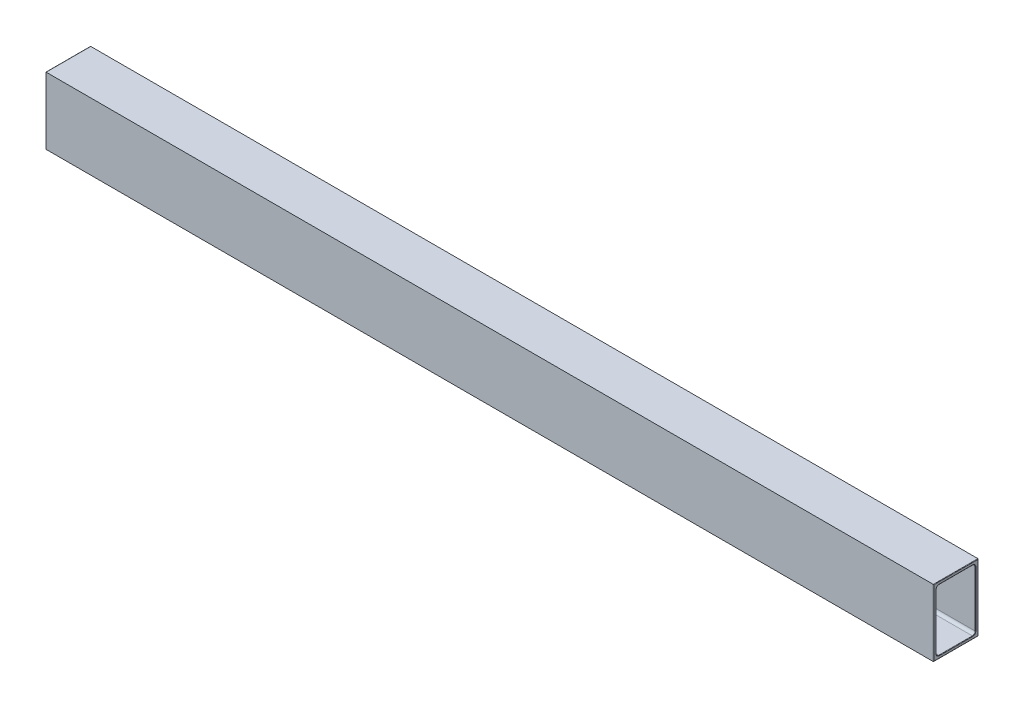
ISO-10303-21;
HEADER;
FILE_DESCRIPTION(('STEP AP214'),'2;1');
FILE_NAME('part.step','',(''),(''),'','','');
FILE_SCHEMA(('AUTOMOTIVE_DESIGN { 1 0 10303 214 1 1 1 1 }'));
ENDSEC;
DATA;
#1=APPLICATION_CONTEXT('core data for automotive mechanical design processes');
#2=APPLICATION_PROTOCOL_DEFINITION('international standard','automotive_design',2000,#1);
#3=PRODUCT_CONTEXT('',#1,'mechanical');
#4=PRODUCT('Part','Part','',(#3));
#5=PRODUCT_RELATED_PRODUCT_CATEGORY('part','',(#4));
#6=PRODUCT_DEFINITION_FORMATION('','',#4);
#7=PRODUCT_DEFINITION_CONTEXT('part definition',#1,'design');
#8=PRODUCT_DEFINITION('design','',#6,#7);
#9=PRODUCT_DEFINITION_SHAPE('','',#8);
#10=(LENGTH_UNIT() NAMED_UNIT(*) SI_UNIT(.MILLI.,.METRE.));
#11=(NAMED_UNIT(*) PLANE_ANGLE_UNIT() SI_UNIT($,.RADIAN.));
#12=(NAMED_UNIT(*) SI_UNIT($,.STERADIAN.) SOLID_ANGLE_UNIT());
#13=UNCERTAINTY_MEASURE_WITH_UNIT(LENGTH_MEASURE(1.E-05),#10,'distance_accuracy_value','');
#14=(GEOMETRIC_REPRESENTATION_CONTEXT(3) GLOBAL_UNCERTAINTY_ASSIGNED_CONTEXT((#13)) GLOBAL_UNIT_ASSIGNED_CONTEXT((#10,
#11,#12)) REPRESENTATION_CONTEXT('',''));
#15=CARTESIAN_POINT('',(0.,0.,0.));
#16=DIRECTION('',(0.,0.,1.));
#17=DIRECTION('',(1.,0.,0.));
#18=AXIS2_PLACEMENT_3D('',#15,#16,#17);
#19=CARTESIAN_POINT('',(2022.623564854,0.,0.));
#20=DIRECTION('',(0.,1.,0.));
#21=DIRECTION('',(0.,0.,1.));
#22=AXIS2_PLACEMENT_3D('',#19,#20,#21);
#23=PLANE('',#22);
#24=DIRECTION('',(0.,0.,-1.));
#25=VECTOR('',#24,1.);
#26=CARTESIAN_POINT('',(858.911782427,0.,0.));
#27=LINE('',#26,#25);
#28=CARTESIAN_POINT('',(858.911782427,0.,101.6));
#29=VERTEX_POINT('',#28);
#30=CARTESIAN_POINT('',(858.911782427,0.,0.));
#31=VERTEX_POINT('',#30);
#32=EDGE_CURVE('E11',#29,#31,#27,.T.);
#33=ORIENTED_EDGE('',*,*,#32,.F.);
#34=DIRECTION('',(-1.,0.,0.));
#35=VECTOR('',#34,1.);
#36=CARTESIAN_POINT('',(2022.623564854,0.,101.6));
#37=LINE('',#36,#35);
#38=CARTESIAN_POINT('',(0.99999999999989,0.,101.6));
#39=VERTEX_POINT('',#38);
#40=EDGE_CURVE('E448',#29,#39,#37,.T.);
#41=ORIENTED_EDGE('',*,*,#40,.T.);
#42=DIRECTION('',(0.,0.,-1.));
#43=VECTOR('',#42,1.);
#44=CARTESIAN_POINT('',(0.99999999999989,0.,0.));
#45=LINE('',#44,#43);
#46=CARTESIAN_POINT('',(0.99999999999989,0.,0.));
#47=VERTEX_POINT('',#46);
#48=EDGE_CURVE('E219',#39,#47,#45,.T.);
#49=ORIENTED_EDGE('',*,*,#48,.T.);
#50=DIRECTION('',(-1.,0.,0.));
#51=VECTOR('',#50,1.);
#52=CARTESIAN_POINT('',(2022.623564854,0.,0.));
#53=LINE('',#52,#51);
#54=EDGE_CURVE('E454',#31,#47,#53,.T.);
#55=ORIENTED_EDGE('',*,*,#54,.F.);
#56=EDGE_LOOP('',(#33,#41,#49,#55));
#57=FACE_BOUND('',#56,.T.);
#58=ADVANCED_FACE('F35',(#57),#23,.F.);
#59=DIRECTION('',(0.,0.,1.));
#60=VECTOR('',#59,1.);
#61=CARTESIAN_POINT('',(1163.711782427,0.,0.));
#62=LINE('',#61,#60);
#63=CARTESIAN_POINT('',(1163.711782427,0.,0.));
#64=VERTEX_POINT('',#63);
#65=CARTESIAN_POINT('',(1163.711782427,0.,101.6));
#66=VERTEX_POINT('',#65);
#67=EDGE_CURVE('E44',#64,#66,#62,.T.);
#68=ORIENTED_EDGE('',*,*,#67,.F.);
#69=CARTESIAN_POINT('',(2021.623564854,0.,0.));
#70=VERTEX_POINT('',#69);
#71=EDGE_CURVE('E450',#70,#64,#53,.T.);
#72=ORIENTED_EDGE('',*,*,#71,.F.);
#73=DIRECTION('',(0.,0.,-1.));
#74=VECTOR('',#73,1.);
#75=CARTESIAN_POINT('',(2021.623564854,0.,101.6));
#76=LINE('',#75,#74);
#77=CARTESIAN_POINT('',(2021.623564854,0.,101.6));
#78=VERTEX_POINT('',#77);
#79=EDGE_CURVE('E303',#70,#78,#76,.F.);
#80=ORIENTED_EDGE('',*,*,#79,.T.);
#81=EDGE_CURVE('E443',#78,#66,#37,.T.);
#82=ORIENTED_EDGE('',*,*,#81,.T.);
#83=EDGE_LOOP('',(#68,#72,#80,#82));
#84=FACE_BOUND('',#83,.T.);
#85=ADVANCED_FACE('F567',(#84),#23,.F.);
#86=CARTESIAN_POINT('',(2022.623564854,0.,0.));
#87=DIRECTION('',(1.,0.,0.));
#88=DIRECTION('',(0.,0.,-1.));
#89=AXIS2_PLACEMENT_3D('',#86,#87,#88);
#90=PLANE('',#89);
#91=DIRECTION('',(0.,1.,0.));
#92=VECTOR('',#91,1.);
#93=CARTESIAN_POINT('',(2022.623564854,0.,5.35));
#94=LINE('',#93,#92);
#95=CARTESIAN_POINT('',(2022.623564854,139.7,5.34999999999999));
#96=VERTEX_POINT('',#95);
#97=CARTESIAN_POINT('',(2022.623564854,12.7,5.35));
#98=VERTEX_POINT('',#97);
#99=EDGE_CURVE('E271',#96,#98,#94,.F.);
#100=ORIENTED_EDGE('',*,*,#99,.T.);
#101=CARTESIAN_POINT('',(2022.623564854,12.7,12.7));
#102=DIRECTION('',(1.,0.,0.));
#103=DIRECTION('',(0.,0.,-1.));
#104=AXIS2_PLACEMENT_3D('',#101,#102,#103);
#105=CIRCLE('',#104,7.35);
#106=CARTESIAN_POINT('',(2022.623564854,5.35,12.7));
#107=VERTEX_POINT('',#106);
#108=EDGE_CURVE('E273',#98,#107,#105,.F.);
#109=ORIENTED_EDGE('',*,*,#108,.T.);
#110=DIRECTION('',(0.,0.,-1.));
#111=VECTOR('',#110,1.);
#112=CARTESIAN_POINT('',(2022.623564854,5.35,0.));
#113=LINE('',#112,#111);
#114=CARTESIAN_POINT('',(2022.623564854,5.34999999999999,88.9));
#115=VERTEX_POINT('',#114);
#116=EDGE_CURVE('E236',#107,#115,#113,.F.);
#117=ORIENTED_EDGE('',*,*,#116,.T.);
#118=CARTESIAN_POINT('',(2022.623564854,12.7,88.9));
#119=DIRECTION('',(1.,0.,0.));
#120=DIRECTION('',(0.,0.,-1.));
#121=AXIS2_PLACEMENT_3D('',#118,#119,#120);
#122=CIRCLE('',#121,7.35);
#123=CARTESIAN_POINT('',(2022.623564854,12.7,96.25));
#124=VERTEX_POINT('',#123);
#125=EDGE_CURVE('E261',#115,#124,#122,.F.);
#126=ORIENTED_EDGE('',*,*,#125,.T.);
#127=DIRECTION('',(0.,-1.,0.));
#128=VECTOR('',#127,1.);
#129=CARTESIAN_POINT('',(2022.623564854,0.,96.25));
#130=LINE('',#129,#128);
#131=CARTESIAN_POINT('',(2022.623564854,139.7,96.25));
#132=VERTEX_POINT('',#131);
#133=EDGE_CURVE('E263',#124,#132,#130,.F.);
#134=ORIENTED_EDGE('',*,*,#133,.T.);
#135=CARTESIAN_POINT('',(2022.623564854,139.7,88.9));
#136=DIRECTION('',(1.,0.,0.));
#137=DIRECTION('',(0.,0.,-1.));
#138=AXIS2_PLACEMENT_3D('',#135,#136,#137);
#139=CIRCLE('',#138,7.34999999999999);
#140=CARTESIAN_POINT('',(2022.623564854,147.05,88.9));
#141=VERTEX_POINT('',#140);
#142=EDGE_CURVE('E265',#132,#141,#139,.F.);
#143=ORIENTED_EDGE('',*,*,#142,.T.);
#144=DIRECTION('',(0.,0.,1.));
#145=VECTOR('',#144,1.);
#146=CARTESIAN_POINT('',(2022.623564854,147.05,1.07124865991555E-13));
#147=LINE('',#146,#145);
#148=CARTESIAN_POINT('',(2022.623564854,147.05,12.7));
#149=VERTEX_POINT('',#148);
#150=EDGE_CURVE('E267',#141,#149,#147,.F.);
#151=ORIENTED_EDGE('',*,*,#150,.T.);
#152=CARTESIAN_POINT('',(2022.623564854,139.7,12.7));
#153=DIRECTION('',(1.,0.,0.));
#154=DIRECTION('',(0.,0.,-1.));
#155=AXIS2_PLACEMENT_3D('',#152,#153,#154);
#156=CIRCLE('',#155,7.35000000000001);
#157=EDGE_CURVE('E269',#149,#96,#156,.F.);
#158=ORIENTED_EDGE('',*,*,#157,.T.);
#159=EDGE_LOOP('',(#100,#109,#117,#126,#134,#143,#151,#158));
#160=FACE_BOUND('',#159,.T.);
#161=DIRECTION('',(0.,-1.,0.));
#162=VECTOR('',#161,1.);
#163=CARTESIAN_POINT('',(2022.623564854,0.,100.6));
#164=LINE('',#163,#162);
#165=CARTESIAN_POINT('',(2022.623564854,151.4,100.6));
#166=VERTEX_POINT('',#165);
#167=CARTESIAN_POINT('',(2022.623564854,0.999999999999982,100.6));
#168=VERTEX_POINT('',#167);
#169=EDGE_CURVE('E255',#166,#168,#164,.T.);
#170=ORIENTED_EDGE('',*,*,#169,.T.);
#171=DIRECTION('',(0.,0.,-1.));
#172=VECTOR('',#171,1.);
#173=CARTESIAN_POINT('',(2022.623564854,1.,0.));
#174=LINE('',#173,#172);
#175=CARTESIAN_POINT('',(2022.623564854,1.,1.));
#176=VERTEX_POINT('',#175);
#177=EDGE_CURVE('E257',#168,#176,#174,.T.);
#178=ORIENTED_EDGE('',*,*,#177,.T.);
#179=DIRECTION('',(0.,1.,0.));
#180=VECTOR('',#179,1.);
#181=CARTESIAN_POINT('',(2022.623564854,152.4,1.));
#182=LINE('',#181,#180);
#183=CARTESIAN_POINT('',(2022.623564854,151.4,1.));
#184=VERTEX_POINT('',#183);
#185=EDGE_CURVE('E246',#176,#184,#182,.T.);
#186=ORIENTED_EDGE('',*,*,#185,.T.);
#187=DIRECTION('',(0.,0.,1.));
#188=VECTOR('',#187,1.);
#189=CARTESIAN_POINT('',(2022.623564854,151.4,101.6));
#190=LINE('',#189,#188);
#191=EDGE_CURVE('E248',#184,#166,#190,.T.);
#192=ORIENTED_EDGE('',*,*,#191,.T.);
#193=EDGE_LOOP('',(#170,#178,#186,#192));
#194=FACE_BOUND('',#193,.T.);
#195=ADVANCED_FACE('F537',(#160,#194),#90,.T.);
#196=CARTESIAN_POINT('',(0.,0.,0.));
#197=DIRECTION('',(1.,0.,0.));
#198=DIRECTION('',(0.,0.,-1.));
#199=AXIS2_PLACEMENT_3D('',#196,#197,#198);
#200=PLANE('',#199);
#201=CARTESIAN_POINT('',(0.,139.7,88.9));
#202=DIRECTION('',(1.,0.,0.));
#203=DIRECTION('',(0.,0.,-1.));
#204=AXIS2_PLACEMENT_3D('',#201,#202,#203);
#205=CIRCLE('',#204,7.34999999999999);
#206=CARTESIAN_POINT('',(0.,147.05,88.9));
#207=VERTEX_POINT('',#206);
#208=CARTESIAN_POINT('',(0.,139.7,96.25));
#209=VERTEX_POINT('',#208);
#210=EDGE_CURVE('E341',#207,#209,#205,.T.);
#211=ORIENTED_EDGE('',*,*,#210,.T.);
#212=DIRECTION('',(0.,-1.,0.));
#213=VECTOR('',#212,1.);
#214=CARTESIAN_POINT('',(0.,12.7,96.25));
#215=LINE('',#214,#213);
#216=CARTESIAN_POINT('',(0.,12.7,96.25));
#217=VERTEX_POINT('',#216);
#218=EDGE_CURVE('E343',#209,#217,#215,.T.);
#219=ORIENTED_EDGE('',*,*,#218,.T.);
#220=CARTESIAN_POINT('',(0.,12.7,88.9));
#221=DIRECTION('',(1.,0.,0.));
#222=DIRECTION('',(0.,0.,-1.));
#223=AXIS2_PLACEMENT_3D('',#220,#221,#222);
#224=CIRCLE('',#223,7.35);
#225=CARTESIAN_POINT('',(0.,5.34999999999999,88.9));
#226=VERTEX_POINT('',#225);
#227=EDGE_CURVE('E329',#217,#226,#224,.T.);
#228=ORIENTED_EDGE('',*,*,#227,.T.);
#229=DIRECTION('',(0.,0.,-1.));
#230=VECTOR('',#229,1.);
#231=CARTESIAN_POINT('',(0.,5.35,12.7));
#232=LINE('',#231,#230);
#233=CARTESIAN_POINT('',(0.,5.35,12.7));
#234=VERTEX_POINT('',#233);
#235=EDGE_CURVE('E331',#226,#234,#232,.T.);
#236=ORIENTED_EDGE('',*,*,#235,.T.);
#237=CARTESIAN_POINT('',(0.,12.7,12.7));
#238=DIRECTION('',(1.,0.,0.));
#239=DIRECTION('',(0.,0.,-1.));
#240=AXIS2_PLACEMENT_3D('',#237,#238,#239);
#241=CIRCLE('',#240,7.35);
#242=CARTESIAN_POINT('',(0.,12.7,5.35));
#243=VERTEX_POINT('',#242);
#244=EDGE_CURVE('E333',#234,#243,#241,.T.);
#245=ORIENTED_EDGE('',*,*,#244,.T.);
#246=DIRECTION('',(0.,1.,0.));
#247=VECTOR('',#246,1.);
#248=CARTESIAN_POINT('',(0.,139.7,5.35));
#249=LINE('',#248,#247);
#250=CARTESIAN_POINT('',(0.,139.7,5.35));
#251=VERTEX_POINT('',#250);
#252=EDGE_CURVE('E335',#243,#251,#249,.T.);
#253=ORIENTED_EDGE('',*,*,#252,.T.);
#254=CARTESIAN_POINT('',(0.,139.7,12.7));
#255=DIRECTION('',(1.,0.,0.));
#256=DIRECTION('',(0.,0.,-1.));
#257=AXIS2_PLACEMENT_3D('',#254,#255,#256);
#258=CIRCLE('',#257,7.35000000000001);
#259=CARTESIAN_POINT('',(0.,147.05,12.7));
#260=VERTEX_POINT('',#259);
#261=EDGE_CURVE('E337',#251,#260,#258,.T.);
#262=ORIENTED_EDGE('',*,*,#261,.T.);
#263=DIRECTION('',(0.,0.,1.));
#264=VECTOR('',#263,1.);
#265=CARTESIAN_POINT('',(0.,147.05,88.9));
#266=LINE('',#265,#264);
#267=EDGE_CURVE('E339',#260,#207,#266,.T.);
#268=ORIENTED_EDGE('',*,*,#267,.T.);
#269=EDGE_LOOP('',(#211,#219,#228,#236,#245,#253,#262,#268));
#270=FACE_BOUND('',#269,.T.);
#271=DIRECTION('',(0.,-1.,0.));
#272=VECTOR('',#271,1.);
#273=CARTESIAN_POINT('',(0.,0.,100.6));
#274=LINE('',#273,#272);
#275=CARTESIAN_POINT('',(0.,0.999999999999982,100.6));
#276=VERTEX_POINT('',#275);
#277=CARTESIAN_POINT('',(0.,151.4,100.6));
#278=VERTEX_POINT('',#277);
#279=EDGE_CURVE('E324',#276,#278,#274,.F.);
#280=ORIENTED_EDGE('',*,*,#279,.T.);
#281=DIRECTION('',(0.,0.,1.));
#282=VECTOR('',#281,1.);
#283=CARTESIAN_POINT('',(0.,151.4,0.));
#284=LINE('',#283,#282);
#285=CARTESIAN_POINT('',(0.,151.4,1.));
#286=VERTEX_POINT('',#285);
#287=EDGE_CURVE('E326',#278,#286,#284,.F.);
#288=ORIENTED_EDGE('',*,*,#287,.T.);
#289=DIRECTION('',(0.,1.,0.));
#290=VECTOR('',#289,1.);
#291=CARTESIAN_POINT('',(0.,0.,1.));
#292=LINE('',#291,#290);
#293=CARTESIAN_POINT('',(0.,1.,1.));
#294=VERTEX_POINT('',#293);
#295=EDGE_CURVE('E320',#286,#294,#292,.F.);
#296=ORIENTED_EDGE('',*,*,#295,.T.);
#297=DIRECTION('',(0.,0.,-1.));
#298=VECTOR('',#297,1.);
#299=CARTESIAN_POINT('',(0.,1.,0.));
#300=LINE('',#299,#298);
#301=EDGE_CURVE('E322',#294,#276,#300,.F.);
#302=ORIENTED_EDGE('',*,*,#301,.T.);
#303=EDGE_LOOP('',(#280,#288,#296,#302));
#304=FACE_BOUND('',#303,.T.);
#305=ADVANCED_FACE('F422',(#270,#304),#200,.F.);
#306=CARTESIAN_POINT('',(2022.623564854,0.,0.));
#307=DIRECTION('',(0.,0.,1.));
#308=DIRECTION('',(1.,0.,0.));
#309=AXIS2_PLACEMENT_3D('',#306,#307,#308);
#310=PLANE('',#309);
#311=DIRECTION('',(-1.,0.,0.));
#312=VECTOR('',#311,1.);
#313=CARTESIAN_POINT('',(2022.623564854,152.4,0.));
#314=LINE('',#313,#312);
#315=CARTESIAN_POINT('',(2021.623564854,152.4,0.));
#316=VERTEX_POINT('',#315);
#317=CARTESIAN_POINT('',(0.99999999999989,152.4,0.));
#318=VERTEX_POINT('',#317);
#319=EDGE_CURVE('E250',#316,#318,#314,.T.);
#320=ORIENTED_EDGE('',*,*,#319,.F.);
#321=DIRECTION('',(0.,1.,0.));
#322=VECTOR('',#321,1.);
#323=CARTESIAN_POINT('',(2021.623564854,0.,0.));
#324=LINE('',#323,#322);
#325=EDGE_CURVE('E318',#316,#70,#324,.F.);
#326=ORIENTED_EDGE('',*,*,#325,.T.);
#327=ORIENTED_EDGE('',*,*,#71,.T.);
#328=EDGE_CURVE('E453',#64,#31,#53,.T.);
#329=ORIENTED_EDGE('',*,*,#328,.T.);
#330=ORIENTED_EDGE('',*,*,#54,.T.);
#331=DIRECTION('',(0.,1.,0.));
#332=VECTOR('',#331,1.);
#333=CARTESIAN_POINT('',(0.99999999999989,0.,0.));
#334=LINE('',#333,#332);
#335=EDGE_CURVE('E316',#47,#318,#334,.T.);
#336=ORIENTED_EDGE('',*,*,#335,.T.);
#337=EDGE_LOOP('',(#320,#326,#327,#329,#330,#336));
#338=FACE_BOUND('',#337,.T.);
#339=ADVANCED_FACE('F584',(#338),#310,.F.);
#340=CARTESIAN_POINT('',(2022.623564854,152.4,0.));
#341=DIRECTION('',(0.,-1.,0.));
#342=DIRECTION('',(0.,0.,-1.));
#343=AXIS2_PLACEMENT_3D('',#340,#341,#342);
#344=PLANE('',#343);
#345=DIRECTION('',(-1.,0.,0.));
#346=VECTOR('',#345,1.);
#347=CARTESIAN_POINT('',(2022.623564854,152.4,101.6));
#348=LINE('',#347,#346);
#349=CARTESIAN_POINT('',(2021.623564854,152.4,101.6));
#350=VERTEX_POINT('',#349);
#351=CARTESIAN_POINT('',(0.99999999999989,152.4,101.6));
#352=VERTEX_POINT('',#351);
#353=EDGE_CURVE('E437',#350,#352,#348,.T.);
#354=ORIENTED_EDGE('',*,*,#353,.F.);
#355=DIRECTION('',(0.,0.,1.));
#356=VECTOR('',#355,1.);
#357=CARTESIAN_POINT('',(2021.623564854,152.4,0.));
#358=LINE('',#357,#356);
#359=EDGE_CURVE('E314',#350,#316,#358,.F.);
#360=ORIENTED_EDGE('',*,*,#359,.T.);
#361=ORIENTED_EDGE('',*,*,#319,.T.);
#362=DIRECTION('',(0.,0.,1.));
#363=VECTOR('',#362,1.);
#364=CARTESIAN_POINT('',(0.99999999999989,152.4,0.));
#365=LINE('',#364,#363);
#366=EDGE_CURVE('E311',#318,#352,#365,.T.);
#367=ORIENTED_EDGE('',*,*,#366,.T.);
#368=EDGE_LOOP('',(#354,#360,#361,#367));
#369=FACE_BOUND('',#368,.T.);
#370=ADVANCED_FACE('F436',(#369),#344,.F.);
#371=CARTESIAN_POINT('',(2022.623564854,0.,101.6));
#372=DIRECTION('',(0.,0.,-1.));
#373=DIRECTION('',(-1.,0.,0.));
#374=AXIS2_PLACEMENT_3D('',#371,#372,#373);
#375=PLANE('',#374);
#376=ORIENTED_EDGE('',*,*,#81,.F.);
#377=DIRECTION('',(0.,-1.,0.));
#378=VECTOR('',#377,1.);
#379=CARTESIAN_POINT('',(2021.623564854,152.4,101.6));
#380=LINE('',#379,#378);
#381=EDGE_CURVE('E309',#78,#350,#380,.F.);
#382=ORIENTED_EDGE('',*,*,#381,.T.);
#383=ORIENTED_EDGE('',*,*,#353,.T.);
#384=DIRECTION('',(0.,-1.,0.));
#385=VECTOR('',#384,1.);
#386=CARTESIAN_POINT('',(0.99999999999989,0.,101.6));
#387=LINE('',#386,#385);
#388=EDGE_CURVE('E306',#352,#39,#387,.T.);
#389=ORIENTED_EDGE('',*,*,#388,.T.);
#390=ORIENTED_EDGE('',*,*,#40,.F.);
#391=EDGE_CURVE('E446',#66,#29,#37,.T.);
#392=ORIENTED_EDGE('',*,*,#391,.F.);
#393=EDGE_LOOP('',(#376,#382,#383,#389,#390,#392));
#394=FACE_BOUND('',#393,.T.);
#395=ADVANCED_FACE('F441',(#394),#375,.F.);
#396=ORIENTED_EDGE('',*,*,#391,.T.);
#397=ORIENTED_EDGE('',*,*,#32,.T.);
#398=ORIENTED_EDGE('',*,*,#328,.F.);
#399=ORIENTED_EDGE('',*,*,#67,.T.);
#400=EDGE_LOOP('',(#396,#397,#398,#399));
#401=FACE_BOUND('',#400,.T.);
#402=ADVANCED_FACE('F569',(#401),#23,.F.);
#403=CARTESIAN_POINT('',(2022.623564854,12.7,88.9));
#404=DIRECTION('',(-1.,0.,0.));
#405=DIRECTION('',(0.,0.,1.));
#406=AXIS2_PLACEMENT_3D('',#403,#404,#405);
#407=CYLINDRICAL_SURFACE('',#406,6.35);
#408=DIRECTION('',(-1.,0.,0.));
#409=VECTOR('',#408,1.);
#410=CARTESIAN_POINT('',(2022.623564854,12.7,95.25));
#411=LINE('',#410,#409);
#412=CARTESIAN_POINT('',(2021.623564854,12.7,95.25));
#413=VERTEX_POINT('',#412);
#414=CARTESIAN_POINT('',(0.99999999999989,12.7,95.25));
#415=VERTEX_POINT('',#414);
#416=EDGE_CURVE('E364',#413,#415,#411,.T.);
#417=ORIENTED_EDGE('',*,*,#416,.F.);
#418=CARTESIAN_POINT('',(2021.623564854,12.7,88.9));
#419=DIRECTION('',(1.,0.,0.));
#420=DIRECTION('',(0.,0.,-1.));
#421=AXIS2_PLACEMENT_3D('',#418,#419,#420);
#422=CIRCLE('',#421,6.35);
#423=CARTESIAN_POINT('',(2021.623564854,6.34999999999999,88.9));
#424=VERTEX_POINT('',#423);
#425=EDGE_CURVE('E298',#413,#424,#422,.T.);
#426=ORIENTED_EDGE('',*,*,#425,.T.);
#427=DIRECTION('',(-1.,0.,0.));
#428=VECTOR('',#427,1.);
#429=CARTESIAN_POINT('',(2022.623564854,6.34999999999999,88.9));
#430=LINE('',#429,#428);
#431=CARTESIAN_POINT('',(0.99999999999989,6.34999999999999,88.9));
#432=VERTEX_POINT('',#431);
#433=EDGE_CURVE('E214',#424,#432,#430,.T.);
#434=ORIENTED_EDGE('',*,*,#433,.T.);
#435=CARTESIAN_POINT('',(0.99999999999989,12.7,88.9));
#436=DIRECTION('',(1.,0.,0.));
#437=DIRECTION('',(0.,0.,-1.));
#438=AXIS2_PLACEMENT_3D('',#435,#436,#437);
#439=CIRCLE('',#438,6.35);
#440=EDGE_CURVE('E296',#432,#415,#439,.F.);
#441=ORIENTED_EDGE('',*,*,#440,.T.);
#442=EDGE_LOOP('',(#417,#426,#434,#441));
#443=FACE_BOUND('',#442,.T.);
#444=ADVANCED_FACE('F530',(#443),#407,.F.);
#445=CARTESIAN_POINT('',(2022.623564854,6.35,12.7));
#446=DIRECTION('',(0.,1.,0.));
#447=DIRECTION('',(0.,0.,1.));
#448=AXIS2_PLACEMENT_3D('',#445,#446,#447);
#449=PLANE('',#448);
#450=ORIENTED_EDGE('',*,*,#433,.F.);
#451=DIRECTION('',(0.,0.,-1.));
#452=VECTOR('',#451,1.);
#453=CARTESIAN_POINT('',(2021.623564854,6.35,12.7));
#454=LINE('',#453,#452);
#455=CARTESIAN_POINT('',(2021.623564854,6.35,12.7));
#456=VERTEX_POINT('',#455);
#457=EDGE_CURVE('E208',#424,#456,#454,.T.);
#458=ORIENTED_EDGE('',*,*,#457,.T.);
#459=DIRECTION('',(-1.,0.,0.));
#460=VECTOR('',#459,1.);
#461=CARTESIAN_POINT('',(2022.623564854,6.35,12.7));
#462=LINE('',#461,#460);
#463=CARTESIAN_POINT('',(0.99999999999989,6.35,12.7));
#464=VERTEX_POINT('',#463);
#465=EDGE_CURVE('E211',#456,#464,#462,.T.);
#466=ORIENTED_EDGE('',*,*,#465,.T.);
#467=DIRECTION('',(0.,0.,-1.));
#468=VECTOR('',#467,1.);
#469=CARTESIAN_POINT('',(1.,6.34999999999999,88.9));
#470=LINE('',#469,#468);
#471=EDGE_CURVE('E220',#464,#432,#470,.F.);
#472=ORIENTED_EDGE('',*,*,#471,.T.);
#473=EDGE_LOOP('',(#450,#458,#466,#472));
#474=FACE_BOUND('',#473,.T.);
#475=ADVANCED_FACE('F210',(#474),#449,.T.);
#476=CARTESIAN_POINT('',(2022.623564854,12.7,12.7));
#477=DIRECTION('',(-1.,0.,0.));
#478=DIRECTION('',(0.,0.,1.));
#479=AXIS2_PLACEMENT_3D('',#476,#477,#478);
#480=CYLINDRICAL_SURFACE('',#479,6.35);
#481=ORIENTED_EDGE('',*,*,#465,.F.);
#482=CARTESIAN_POINT('',(2021.623564854,12.7,12.7));
#483=DIRECTION('',(1.,0.,0.));
#484=DIRECTION('',(0.,0.,-1.));
#485=AXIS2_PLACEMENT_3D('',#482,#483,#484);
#486=CIRCLE('',#485,6.35);
#487=CARTESIAN_POINT('',(2021.623564854,12.7,6.35));
#488=VERTEX_POINT('',#487);
#489=EDGE_CURVE('E227',#456,#488,#486,.T.);
#490=ORIENTED_EDGE('',*,*,#489,.T.);
#491=DIRECTION('',(-1.,0.,0.));
#492=VECTOR('',#491,1.);
#493=CARTESIAN_POINT('',(2022.623564854,12.7,6.35));
#494=LINE('',#493,#492);
#495=CARTESIAN_POINT('',(0.99999999999989,12.7,6.35));
#496=VERTEX_POINT('',#495);
#497=EDGE_CURVE('E231',#488,#496,#494,.T.);
#498=ORIENTED_EDGE('',*,*,#497,.T.);
#499=CARTESIAN_POINT('',(0.99999999999989,12.7,12.7));
#500=DIRECTION('',(1.,0.,0.));
#501=DIRECTION('',(0.,0.,-1.));
#502=AXIS2_PLACEMENT_3D('',#499,#500,#501);
#503=CIRCLE('',#502,6.35);
#504=EDGE_CURVE('E230',#496,#464,#503,.F.);
#505=ORIENTED_EDGE('',*,*,#504,.T.);
#506=EDGE_LOOP('',(#481,#490,#498,#505));
#507=FACE_BOUND('',#506,.T.);
#508=ADVANCED_FACE('F224',(#507),#480,.F.);
#509=CARTESIAN_POINT('',(2022.623564854,12.7,6.35));
#510=DIRECTION('',(0.,0.,1.));
#511=DIRECTION('',(0.,-1.,0.));
#512=AXIS2_PLACEMENT_3D('',#509,#510,#511);
#513=PLANE('',#512);
#514=ORIENTED_EDGE('',*,*,#497,.F.);
#515=DIRECTION('',(0.,1.,0.));
#516=VECTOR('',#515,1.);
#517=CARTESIAN_POINT('',(2021.623564854,12.7,6.35));
#518=LINE('',#517,#516);
#519=CARTESIAN_POINT('',(2021.623564854,139.7,6.34999999999999));
#520=VERTEX_POINT('',#519);
#521=EDGE_CURVE('E277',#488,#520,#518,.T.);
#522=ORIENTED_EDGE('',*,*,#521,.T.);
#523=DIRECTION('',(-1.,0.,0.));
#524=VECTOR('',#523,1.);
#525=CARTESIAN_POINT('',(2022.623564854,139.7,6.34999999999999));
#526=LINE('',#525,#524);
#527=CARTESIAN_POINT('',(0.99999999999989,139.7,6.34999999999999));
#528=VERTEX_POINT('',#527);
#529=EDGE_CURVE('E457',#520,#528,#526,.T.);
#530=ORIENTED_EDGE('',*,*,#529,.T.);
#531=DIRECTION('',(0.,1.,0.));
#532=VECTOR('',#531,1.);
#533=CARTESIAN_POINT('',(1.,12.7,6.35));
#534=LINE('',#533,#532);
#535=EDGE_CURVE('E275',#528,#496,#534,.F.);
#536=ORIENTED_EDGE('',*,*,#535,.T.);
#537=EDGE_LOOP('',(#514,#522,#530,#536));
#538=FACE_BOUND('',#537,.T.);
#539=ADVANCED_FACE('F519',(#538),#513,.T.);
#540=CARTESIAN_POINT('',(2022.623564854,139.7,12.7));
#541=DIRECTION('',(-1.,0.,0.));
#542=DIRECTION('',(0.,0.,1.));
#543=AXIS2_PLACEMENT_3D('',#540,#541,#542);
#544=CYLINDRICAL_SURFACE('',#543,6.35000000000001);
#545=ORIENTED_EDGE('',*,*,#529,.F.);
#546=CARTESIAN_POINT('',(2021.623564854,139.7,12.7));
#547=DIRECTION('',(1.,0.,0.));
#548=DIRECTION('',(0.,0.,-1.));
#549=AXIS2_PLACEMENT_3D('',#546,#547,#548);
#550=CIRCLE('',#549,6.35000000000001);
#551=CARTESIAN_POINT('',(2021.623564854,146.05,12.7));
#552=VERTEX_POINT('',#551);
#553=EDGE_CURVE('E281',#520,#552,#550,.T.);
#554=ORIENTED_EDGE('',*,*,#553,.T.);
#555=DIRECTION('',(-1.,0.,0.));
#556=VECTOR('',#555,1.);
#557=CARTESIAN_POINT('',(2022.623564854,146.05,12.7));
#558=LINE('',#557,#556);
#559=CARTESIAN_POINT('',(0.99999999999989,146.05,12.7));
#560=VERTEX_POINT('',#559);
#561=EDGE_CURVE('E460',#552,#560,#558,.T.);
#562=ORIENTED_EDGE('',*,*,#561,.T.);
#563=CARTESIAN_POINT('',(0.99999999999989,139.7,12.7));
#564=DIRECTION('',(1.,0.,0.));
#565=DIRECTION('',(0.,0.,-1.));
#566=AXIS2_PLACEMENT_3D('',#563,#564,#565);
#567=CIRCLE('',#566,6.35000000000001);
#568=EDGE_CURVE('E279',#560,#528,#567,.F.);
#569=ORIENTED_EDGE('',*,*,#568,.T.);
#570=EDGE_LOOP('',(#545,#554,#562,#569));
#571=FACE_BOUND('',#570,.T.);
#572=ADVANCED_FACE('F515',(#571),#544,.F.);
#573=CARTESIAN_POINT('',(2022.623564854,146.05,12.7));
#574=DIRECTION('',(0.,-1.,0.));
#575=DIRECTION('',(0.,0.,-1.));
#576=AXIS2_PLACEMENT_3D('',#573,#574,#575);
#577=PLANE('',#576);
#578=ORIENTED_EDGE('',*,*,#561,.F.);
#579=DIRECTION('',(0.,0.,1.));
#580=VECTOR('',#579,1.);
#581=CARTESIAN_POINT('',(2021.623564854,146.05,12.7));
#582=LINE('',#581,#580);
#583=CARTESIAN_POINT('',(2021.623564854,146.05,88.9));
#584=VERTEX_POINT('',#583);
#585=EDGE_CURVE('E285',#552,#584,#582,.T.);
#586=ORIENTED_EDGE('',*,*,#585,.T.);
#587=DIRECTION('',(-1.,0.,0.));
#588=VECTOR('',#587,1.);
#589=CARTESIAN_POINT('',(2022.623564854,146.05,88.9));
#590=LINE('',#589,#588);
#591=CARTESIAN_POINT('',(0.99999999999989,146.05,88.9));
#592=VERTEX_POINT('',#591);
#593=EDGE_CURVE('E463',#584,#592,#590,.T.);
#594=ORIENTED_EDGE('',*,*,#593,.T.);
#595=DIRECTION('',(0.,0.,1.));
#596=VECTOR('',#595,1.);
#597=CARTESIAN_POINT('',(1.,146.05,12.7));
#598=LINE('',#597,#596);
#599=EDGE_CURVE('E283',#592,#560,#598,.F.);
#600=ORIENTED_EDGE('',*,*,#599,.T.);
#601=EDGE_LOOP('',(#578,#586,#594,#600));
#602=FACE_BOUND('',#601,.T.);
#603=ADVANCED_FACE('F503',(#602),#577,.T.);
#604=CARTESIAN_POINT('',(2022.623564854,139.7,88.9));
#605=DIRECTION('',(-1.,0.,0.));
#606=DIRECTION('',(0.,0.,1.));
#607=AXIS2_PLACEMENT_3D('',#604,#605,#606);
#608=CYLINDRICAL_SURFACE('',#607,6.34999999999999);
#609=ORIENTED_EDGE('',*,*,#593,.F.);
#610=CARTESIAN_POINT('',(2021.623564854,139.7,88.9));
#611=DIRECTION('',(1.,0.,0.));
#612=DIRECTION('',(0.,0.,-1.));
#613=AXIS2_PLACEMENT_3D('',#610,#611,#612);
#614=CIRCLE('',#613,6.34999999999999);
#615=CARTESIAN_POINT('',(2021.623564854,139.7,95.25));
#616=VERTEX_POINT('',#615);
#617=EDGE_CURVE('E289',#584,#616,#614,.T.);
#618=ORIENTED_EDGE('',*,*,#617,.T.);
#619=DIRECTION('',(-1.,0.,0.));
#620=VECTOR('',#619,1.);
#621=CARTESIAN_POINT('',(2022.623564854,139.7,95.25));
#622=LINE('',#621,#620);
#623=CARTESIAN_POINT('',(0.99999999999989,139.7,95.25));
#624=VERTEX_POINT('',#623);
#625=EDGE_CURVE('E466',#616,#624,#622,.T.);
#626=ORIENTED_EDGE('',*,*,#625,.T.);
#627=CARTESIAN_POINT('',(0.99999999999989,139.7,88.9));
#628=DIRECTION('',(1.,0.,0.));
#629=DIRECTION('',(0.,0.,-1.));
#630=AXIS2_PLACEMENT_3D('',#627,#628,#629);
#631=CIRCLE('',#630,6.34999999999999);
#632=EDGE_CURVE('E287',#624,#592,#631,.F.);
#633=ORIENTED_EDGE('',*,*,#632,.T.);
#634=EDGE_LOOP('',(#609,#618,#626,#633));
#635=FACE_BOUND('',#634,.T.);
#636=ADVANCED_FACE('F498',(#635),#608,.F.);
#637=CARTESIAN_POINT('',(2022.623564854,12.7,95.25));
#638=DIRECTION('',(0.,0.,-1.));
#639=DIRECTION('',(-1.,0.,0.));
#640=AXIS2_PLACEMENT_3D('',#637,#638,#639);
#641=PLANE('',#640);
#642=ORIENTED_EDGE('',*,*,#625,.F.);
#643=DIRECTION('',(0.,-1.,0.));
#644=VECTOR('',#643,1.);
#645=CARTESIAN_POINT('',(2021.623564854,12.7,95.25));
#646=LINE('',#645,#644);
#647=EDGE_CURVE('E294',#616,#413,#646,.T.);
#648=ORIENTED_EDGE('',*,*,#647,.T.);
#649=ORIENTED_EDGE('',*,*,#416,.T.);
#650=DIRECTION('',(0.,-1.,0.));
#651=VECTOR('',#650,1.);
#652=CARTESIAN_POINT('',(1.,139.7,95.25));
#653=LINE('',#652,#651);
#654=EDGE_CURVE('E291',#415,#624,#653,.F.);
#655=ORIENTED_EDGE('',*,*,#654,.T.);
#656=EDGE_LOOP('',(#642,#648,#649,#655));
#657=FACE_BOUND('',#656,.T.);
#658=ADVANCED_FACE('F474',(#657),#641,.T.);
#659=CARTESIAN_POINT('',(2021.623564854,139.7,88.9));
#660=DIRECTION('',(1.,0.,0.));
#661=DIRECTION('',(0.,0.,-1.));
#662=AXIS2_PLACEMENT_3D('',#659,#660,#661);
#663=TOROIDAL_SURFACE('',#662,7.34999999999999,1.);
#664=CARTESIAN_POINT('',(2021.623564854,147.05,88.9));
#665=DIRECTION('',(0.,0.,-1.));
#666=DIRECTION('',(-1.,0.,0.));
#667=AXIS2_PLACEMENT_3D('',#664,#665,#666);
#668=CIRCLE('',#667,1.);
#669=EDGE_CURVE('E358',#141,#584,#668,.T.);
#670=ORIENTED_EDGE('',*,*,#669,.F.);
#671=ORIENTED_EDGE('',*,*,#142,.F.);
#672=CARTESIAN_POINT('',(2021.623564854,139.7,96.25));
#673=DIRECTION('',(0.,-1.,0.));
#674=DIRECTION('',(0.,0.,-1.));
#675=AXIS2_PLACEMENT_3D('',#672,#673,#674);
#676=CIRCLE('',#675,1.);
#677=EDGE_CURVE('E361',#616,#132,#676,.T.);
#678=ORIENTED_EDGE('',*,*,#677,.F.);
#679=ORIENTED_EDGE('',*,*,#617,.F.);
#680=EDGE_LOOP('',(#670,#671,#678,#679));
#681=FACE_BOUND('',#680,.T.);
#682=ADVANCED_FACE('F545',(#681),#663,.T.);
#683=CARTESIAN_POINT('',(2021.623564854,12.7,96.25));
#684=DIRECTION('',(0.,-1.,0.));
#685=DIRECTION('',(0.,0.,-1.));
#686=AXIS2_PLACEMENT_3D('',#683,#684,#685);
#687=CYLINDRICAL_SURFACE('',#686,1.);
#688=ORIENTED_EDGE('',*,*,#677,.T.);
#689=ORIENTED_EDGE('',*,*,#133,.F.);
#690=CARTESIAN_POINT('',(2021.623564854,12.7,96.25));
#691=DIRECTION('',(0.,-1.,0.));
#692=DIRECTION('',(0.,0.,-1.));
#693=AXIS2_PLACEMENT_3D('',#690,#691,#692);
#694=CIRCLE('',#693,1.);
#695=EDGE_CURVE('E355',#413,#124,#694,.T.);
#696=ORIENTED_EDGE('',*,*,#695,.F.);
#697=ORIENTED_EDGE('',*,*,#647,.F.);
#698=EDGE_LOOP('',(#688,#689,#696,#697));
#699=FACE_BOUND('',#698,.T.);
#700=ADVANCED_FACE('F541',(#699),#687,.T.);
#701=CARTESIAN_POINT('',(2021.623564854,147.05,12.7));
#702=DIRECTION('',(0.,0.,1.));
#703=DIRECTION('',(0.,-1.,0.));
#704=AXIS2_PLACEMENT_3D('',#701,#702,#703);
#705=CYLINDRICAL_SURFACE('',#704,1.);
#706=ORIENTED_EDGE('',*,*,#669,.T.);
#707=ORIENTED_EDGE('',*,*,#585,.F.);
#708=CARTESIAN_POINT('',(2021.623564854,147.05,12.7));
#709=DIRECTION('',(0.,0.,-1.));
#710=DIRECTION('',(-1.,0.,0.));
#711=AXIS2_PLACEMENT_3D('',#708,#709,#710);
#712=CIRCLE('',#711,1.);
#713=EDGE_CURVE('E352',#149,#552,#712,.T.);
#714=ORIENTED_EDGE('',*,*,#713,.F.);
#715=ORIENTED_EDGE('',*,*,#150,.F.);
#716=EDGE_LOOP('',(#706,#707,#714,#715));
#717=FACE_BOUND('',#716,.T.);
#718=ADVANCED_FACE('F551',(#717),#705,.T.);
#719=CARTESIAN_POINT('',(2021.623564854,12.7,88.9));
#720=DIRECTION('',(1.,0.,0.));
#721=DIRECTION('',(0.,0.,-1.));
#722=AXIS2_PLACEMENT_3D('',#719,#720,#721);
#723=TOROIDAL_SURFACE('',#722,7.35,1.);
#724=ORIENTED_EDGE('',*,*,#695,.T.);
#725=ORIENTED_EDGE('',*,*,#125,.F.);
#726=CARTESIAN_POINT('',(2021.623564854,5.34999999999999,88.9));
#727=DIRECTION('',(0.,0.,-1.));
#728=DIRECTION('',(-1.,0.,0.));
#729=AXIS2_PLACEMENT_3D('',#726,#727,#728);
#730=CIRCLE('',#729,1.);
#731=EDGE_CURVE('E350',#424,#115,#730,.T.);
#732=ORIENTED_EDGE('',*,*,#731,.F.);
#733=ORIENTED_EDGE('',*,*,#425,.F.);
#734=EDGE_LOOP('',(#724,#725,#732,#733));
#735=FACE_BOUND('',#734,.T.);
#736=ADVANCED_FACE('F533',(#735),#723,.T.);
#737=CARTESIAN_POINT('',(2021.623564854,139.7,12.7));
#738=DIRECTION('',(1.,0.,0.));
#739=DIRECTION('',(0.,0.,-1.));
#740=AXIS2_PLACEMENT_3D('',#737,#738,#739);
#741=TOROIDAL_SURFACE('',#740,7.35000000000001,1.);
#742=ORIENTED_EDGE('',*,*,#713,.T.);
#743=ORIENTED_EDGE('',*,*,#553,.F.);
#744=CARTESIAN_POINT('',(2021.623564854,139.7,5.34999999999999));
#745=DIRECTION('',(0.,-1.,0.));
#746=DIRECTION('',(0.,0.,-1.));
#747=AXIS2_PLACEMENT_3D('',#744,#745,#746);
#748=CIRCLE('',#747,1.);
#749=EDGE_CURVE('E240',#96,#520,#748,.T.);
#750=ORIENTED_EDGE('',*,*,#749,.F.);
#751=ORIENTED_EDGE('',*,*,#157,.F.);
#752=EDGE_LOOP('',(#742,#743,#750,#751));
#753=FACE_BOUND('',#752,.T.);
#754=ADVANCED_FACE('F553',(#753),#741,.T.);
#755=CARTESIAN_POINT('',(2021.623564854,5.35,12.7));
#756=DIRECTION('',(0.,0.,-1.));
#757=DIRECTION('',(0.,1.,0.));
#758=AXIS2_PLACEMENT_3D('',#755,#756,#757);
#759=CYLINDRICAL_SURFACE('',#758,1.);
#760=ORIENTED_EDGE('',*,*,#731,.T.);
#761=ORIENTED_EDGE('',*,*,#116,.F.);
#762=CARTESIAN_POINT('',(2021.623564854,5.35,12.7));
#763=DIRECTION('',(0.,0.,-1.));
#764=DIRECTION('',(-1.,0.,0.));
#765=AXIS2_PLACEMENT_3D('',#762,#763,#764);
#766=CIRCLE('',#765,1.);
#767=EDGE_CURVE('E234',#456,#107,#766,.T.);
#768=ORIENTED_EDGE('',*,*,#767,.F.);
#769=ORIENTED_EDGE('',*,*,#457,.F.);
#770=EDGE_LOOP('',(#760,#761,#768,#769));
#771=FACE_BOUND('',#770,.T.);
#772=ADVANCED_FACE('F235',(#771),#759,.T.);
#773=CARTESIAN_POINT('',(2021.623564854,12.7,5.35));
#774=DIRECTION('',(0.,1.,0.));
#775=DIRECTION('',(0.,0.,1.));
#776=AXIS2_PLACEMENT_3D('',#773,#774,#775);
#777=CYLINDRICAL_SURFACE('',#776,1.);
#778=ORIENTED_EDGE('',*,*,#749,.T.);
#779=ORIENTED_EDGE('',*,*,#521,.F.);
#780=CARTESIAN_POINT('',(2021.623564854,12.7,5.35));
#781=DIRECTION('',(0.,-1.,0.));
#782=DIRECTION('',(0.,0.,-1.));
#783=AXIS2_PLACEMENT_3D('',#780,#781,#782);
#784=CIRCLE('',#783,1.);
#785=EDGE_CURVE('E241',#98,#488,#784,.T.);
#786=ORIENTED_EDGE('',*,*,#785,.F.);
#787=ORIENTED_EDGE('',*,*,#99,.F.);
#788=EDGE_LOOP('',(#778,#779,#786,#787));
#789=FACE_BOUND('',#788,.T.);
#790=ADVANCED_FACE('F556',(#789),#777,.T.);
#791=CARTESIAN_POINT('',(2021.623564854,12.7,12.7));
#792=DIRECTION('',(1.,0.,0.));
#793=DIRECTION('',(0.,0.,-1.));
#794=AXIS2_PLACEMENT_3D('',#791,#792,#793);
#795=TOROIDAL_SURFACE('',#794,7.35,1.);
#796=ORIENTED_EDGE('',*,*,#767,.T.);
#797=ORIENTED_EDGE('',*,*,#108,.F.);
#798=ORIENTED_EDGE('',*,*,#785,.T.);
#799=ORIENTED_EDGE('',*,*,#489,.F.);
#800=EDGE_LOOP('',(#796,#797,#798,#799));
#801=FACE_BOUND('',#800,.T.);
#802=ADVANCED_FACE('F243',(#801),#795,.T.);
#803=CARTESIAN_POINT('',(2021.623564854,151.4,0.));
#804=DIRECTION('',(0.,0.,-1.));
#805=DIRECTION('',(0.,1.,0.));
#806=AXIS2_PLACEMENT_3D('',#803,#804,#805);
#807=CYLINDRICAL_SURFACE('',#806,1.);
#808=CARTESIAN_POINT('',(2021.623564854,151.4,1.));
#809=DIRECTION('',(0.,-0.707106781186547,-0.707106781186548));
#810=DIRECTION('',(0.,-0.707106781186548,0.707106781186547));
#811=AXIS2_PLACEMENT_3D('',#808,#809,#810);
#812=ELLIPSE('',#811,1.4142135623731,1.);
#813=EDGE_CURVE('E370',#316,#184,#812,.T.);
#814=ORIENTED_EDGE('',*,*,#813,.F.);
#815=ORIENTED_EDGE('',*,*,#359,.F.);
#816=CARTESIAN_POINT('',(2021.623564854,151.4,100.6));
#817=DIRECTION('',(0.,0.707106781186548,-0.707106781186547));
#818=DIRECTION('',(0.,-0.707106781186547,-0.707106781186548));
#819=AXIS2_PLACEMENT_3D('',#816,#817,#818);
#820=ELLIPSE('',#819,1.41421356237309,1.);
#821=EDGE_CURVE('E346',#166,#350,#820,.F.);
#822=ORIENTED_EDGE('',*,*,#821,.F.);
#823=ORIENTED_EDGE('',*,*,#191,.F.);
#824=EDGE_LOOP('',(#814,#815,#822,#823));
#825=FACE_BOUND('',#824,.T.);
#826=ADVANCED_FACE('F563',(#825),#807,.T.);
#827=CARTESIAN_POINT('',(2021.623564854,0.,100.6));
#828=DIRECTION('',(0.,1.,0.));
#829=DIRECTION('',(0.,0.,1.));
#830=AXIS2_PLACEMENT_3D('',#827,#828,#829);
#831=CYLINDRICAL_SURFACE('',#830,1.);
#832=ORIENTED_EDGE('',*,*,#821,.T.);
#833=ORIENTED_EDGE('',*,*,#381,.F.);
#834=CARTESIAN_POINT('',(2021.623564854,0.999999999999982,100.6));
#835=DIRECTION('',(0.,0.707106781186547,0.707106781186548));
#836=DIRECTION('',(0.,0.707106781186548,-0.707106781186547));
#837=AXIS2_PLACEMENT_3D('',#834,#835,#836);
#838=ELLIPSE('',#837,1.4142135623731,1.);
#839=EDGE_CURVE('E367',#168,#78,#838,.F.);
#840=ORIENTED_EDGE('',*,*,#839,.F.);
#841=ORIENTED_EDGE('',*,*,#169,.F.);
#842=EDGE_LOOP('',(#832,#833,#840,#841));
#843=FACE_BOUND('',#842,.T.);
#844=ADVANCED_FACE('F601',(#843),#831,.T.);
#845=CARTESIAN_POINT('',(2021.623564854,0.,1.));
#846=DIRECTION('',(0.,-1.,0.));
#847=DIRECTION('',(0.,0.,-1.));
#848=AXIS2_PLACEMENT_3D('',#845,#846,#847);
#849=CYLINDRICAL_SURFACE('',#848,1.);
#850=ORIENTED_EDGE('',*,*,#813,.T.);
#851=ORIENTED_EDGE('',*,*,#185,.F.);
#852=CARTESIAN_POINT('',(2021.623564854,1.,1.));
#853=DIRECTION('',(0.,-0.707106781186548,0.707106781186547));
#854=DIRECTION('',(0.,-0.707106781186547,-0.707106781186548));
#855=AXIS2_PLACEMENT_3D('',#852,#853,#854);
#856=ELLIPSE('',#855,1.41421356237309,1.);
#857=EDGE_CURVE('E365',#70,#176,#856,.T.);
#858=ORIENTED_EDGE('',*,*,#857,.F.);
#859=ORIENTED_EDGE('',*,*,#325,.F.);
#860=EDGE_LOOP('',(#850,#851,#858,#859));
#861=FACE_BOUND('',#860,.T.);
#862=ADVANCED_FACE('F595',(#861),#849,.T.);
#863=CARTESIAN_POINT('',(2021.623564854,1.,0.));
#864=DIRECTION('',(0.,0.,1.));
#865=DIRECTION('',(0.,-1.,0.));
#866=AXIS2_PLACEMENT_3D('',#863,#864,#865);
#867=CYLINDRICAL_SURFACE('',#866,1.);
#868=ORIENTED_EDGE('',*,*,#839,.T.);
#869=ORIENTED_EDGE('',*,*,#79,.F.);
#870=ORIENTED_EDGE('',*,*,#857,.T.);
#871=ORIENTED_EDGE('',*,*,#177,.F.);
#872=EDGE_LOOP('',(#868,#869,#870,#871));
#873=FACE_BOUND('',#872,.T.);
#874=ADVANCED_FACE('F590',(#873),#867,.T.);
#875=CARTESIAN_POINT('',(1.,0.,5.35));
#876=DIRECTION('',(0.,-1.,0.));
#877=DIRECTION('',(0.,0.,-1.));
#878=AXIS2_PLACEMENT_3D('',#875,#876,#877);
#879=CYLINDRICAL_SURFACE('',#878,1.);
#880=CARTESIAN_POINT('',(1.,12.7,5.35));
#881=DIRECTION('',(0.,-1.,0.));
#882=DIRECTION('',(0.,0.,-1.));
#883=AXIS2_PLACEMENT_3D('',#880,#881,#882);
#884=CIRCLE('',#883,1.);
#885=EDGE_CURVE('E392',#496,#243,#884,.T.);
#886=ORIENTED_EDGE('',*,*,#885,.F.);
#887=ORIENTED_EDGE('',*,*,#535,.F.);
#888=CARTESIAN_POINT('',(1.,139.7,5.35));
#889=DIRECTION('',(0.,1.,0.));
#890=DIRECTION('',(0.,0.,1.));
#891=AXIS2_PLACEMENT_3D('',#888,#889,#890);
#892=CIRCLE('',#891,1.);
#893=EDGE_CURVE('E368',#251,#528,#892,.T.);
#894=ORIENTED_EDGE('',*,*,#893,.F.);
#895=ORIENTED_EDGE('',*,*,#252,.F.);
#896=EDGE_LOOP('',(#886,#887,#894,#895));
#897=FACE_BOUND('',#896,.T.);
#898=ADVANCED_FACE('F522',(#897),#879,.T.);
#899=CARTESIAN_POINT('',(0.99999999999989,139.7,12.7));
#900=DIRECTION('',(1.,0.,0.));
#901=DIRECTION('',(0.,0.,-1.));
#902=AXIS2_PLACEMENT_3D('',#899,#900,#901);
#903=TOROIDAL_SURFACE('',#902,7.35000000000001,1.);
#904=ORIENTED_EDGE('',*,*,#893,.T.);
#905=ORIENTED_EDGE('',*,*,#568,.F.);
#906=CARTESIAN_POINT('',(1.,147.05,12.7));
#907=DIRECTION('',(0.,0.,1.));
#908=DIRECTION('',(1.,0.,0.));
#909=AXIS2_PLACEMENT_3D('',#906,#907,#908);
#910=CIRCLE('',#909,1.);
#911=EDGE_CURVE('E389',#260,#560,#910,.T.);
#912=ORIENTED_EDGE('',*,*,#911,.F.);
#913=ORIENTED_EDGE('',*,*,#261,.F.);
#914=EDGE_LOOP('',(#904,#905,#912,#913));
#915=FACE_BOUND('',#914,.T.);
#916=ADVANCED_FACE('F511',(#915),#903,.T.);
#917=CARTESIAN_POINT('',(0.99999999999989,12.7,12.7));
#918=DIRECTION('',(1.,0.,0.));
#919=DIRECTION('',(0.,0.,-1.));
#920=AXIS2_PLACEMENT_3D('',#917,#918,#919);
#921=TOROIDAL_SURFACE('',#920,7.35,1.);
#922=ORIENTED_EDGE('',*,*,#885,.T.);
#923=ORIENTED_EDGE('',*,*,#244,.F.);
#924=CARTESIAN_POINT('',(0.99999999999989,5.35,12.7));
#925=DIRECTION('',(0.,0.,1.));
#926=DIRECTION('',(1.,0.,0.));
#927=AXIS2_PLACEMENT_3D('',#924,#925,#926);
#928=CIRCLE('',#927,1.);
#929=EDGE_CURVE('E386',#464,#234,#928,.T.);
#930=ORIENTED_EDGE('',*,*,#929,.F.);
#931=ORIENTED_EDGE('',*,*,#504,.F.);
#932=EDGE_LOOP('',(#922,#923,#930,#931));
#933=FACE_BOUND('',#932,.T.);
#934=ADVANCED_FACE('F526',(#933),#921,.T.);
#935=CARTESIAN_POINT('',(1.,147.05,1.07124865991555E-13));
#936=DIRECTION('',(0.,0.,-1.));
#937=DIRECTION('',(0.,1.,0.));
#938=AXIS2_PLACEMENT_3D('',#935,#936,#937);
#939=CYLINDRICAL_SURFACE('',#938,1.);
#940=ORIENTED_EDGE('',*,*,#911,.T.);
#941=ORIENTED_EDGE('',*,*,#599,.F.);
#942=CARTESIAN_POINT('',(1.,147.05,88.9));
#943=DIRECTION('',(0.,0.,1.));
#944=DIRECTION('',(1.,0.,0.));
#945=AXIS2_PLACEMENT_3D('',#942,#943,#944);
#946=CIRCLE('',#945,1.);
#947=EDGE_CURVE('E383',#207,#592,#946,.T.);
#948=ORIENTED_EDGE('',*,*,#947,.F.);
#949=ORIENTED_EDGE('',*,*,#267,.F.);
#950=EDGE_LOOP('',(#940,#941,#948,#949));
#951=FACE_BOUND('',#950,.T.);
#952=ADVANCED_FACE('F506',(#951),#939,.T.);
#953=CARTESIAN_POINT('',(1.,5.35,0.));
#954=DIRECTION('',(0.,0.,1.));
#955=DIRECTION('',(0.,-1.,0.));
#956=AXIS2_PLACEMENT_3D('',#953,#954,#955);
#957=CYLINDRICAL_SURFACE('',#956,1.);
#958=ORIENTED_EDGE('',*,*,#929,.T.);
#959=ORIENTED_EDGE('',*,*,#235,.F.);
#960=CARTESIAN_POINT('',(1.,5.34999999999999,88.9));
#961=DIRECTION('',(0.,0.,1.));
#962=DIRECTION('',(1.,0.,0.));
#963=AXIS2_PLACEMENT_3D('',#960,#961,#962);
#964=CIRCLE('',#963,1.);
#965=EDGE_CURVE('E380',#432,#226,#964,.T.);
#966=ORIENTED_EDGE('',*,*,#965,.F.);
#967=ORIENTED_EDGE('',*,*,#471,.F.);
#968=EDGE_LOOP('',(#958,#959,#966,#967));
#969=FACE_BOUND('',#968,.T.);
#970=ADVANCED_FACE('F529',(#969),#957,.T.);
#971=CARTESIAN_POINT('',(0.99999999999989,139.7,88.9));
#972=DIRECTION('',(1.,0.,0.));
#973=DIRECTION('',(0.,0.,-1.));
#974=AXIS2_PLACEMENT_3D('',#971,#972,#973);
#975=TOROIDAL_SURFACE('',#974,7.34999999999999,1.);
#976=ORIENTED_EDGE('',*,*,#947,.T.);
#977=ORIENTED_EDGE('',*,*,#632,.F.);
#978=CARTESIAN_POINT('',(1.,139.7,96.25));
#979=DIRECTION('',(0.,-1.,0.));
#980=DIRECTION('',(0.,0.,-1.));
#981=AXIS2_PLACEMENT_3D('',#978,#979,#980);
#982=CIRCLE('',#981,1.);
#983=EDGE_CURVE('E377',#209,#624,#982,.T.);
#984=ORIENTED_EDGE('',*,*,#983,.F.);
#985=ORIENTED_EDGE('',*,*,#210,.F.);
#986=EDGE_LOOP('',(#976,#977,#984,#985));
#987=FACE_BOUND('',#986,.T.);
#988=ADVANCED_FACE('F495',(#987),#975,.T.);
#989=CARTESIAN_POINT('',(0.99999999999989,12.7,88.9));
#990=DIRECTION('',(1.,0.,0.));
#991=DIRECTION('',(0.,0.,-1.));
#992=AXIS2_PLACEMENT_3D('',#989,#990,#991);
#993=TOROIDAL_SURFACE('',#992,7.35,1.);
#994=ORIENTED_EDGE('',*,*,#965,.T.);
#995=ORIENTED_EDGE('',*,*,#227,.F.);
#996=CARTESIAN_POINT('',(0.99999999999989,12.7,96.25));
#997=DIRECTION('',(0.,1.,0.));
#998=DIRECTION('',(0.,0.,1.));
#999=AXIS2_PLACEMENT_3D('',#996,#997,#998);
#1000=CIRCLE('',#999,1.);
#1001=EDGE_CURVE('E375',#415,#217,#1000,.T.);
#1002=ORIENTED_EDGE('',*,*,#1001,.F.);
#1003=ORIENTED_EDGE('',*,*,#440,.F.);
#1004=EDGE_LOOP('',(#994,#995,#1002,#1003));
#1005=FACE_BOUND('',#1004,.T.);
#1006=ADVANCED_FACE('F487',(#1005),#993,.T.);
#1007=CARTESIAN_POINT('',(1.,0.,96.25));
#1008=DIRECTION('',(0.,1.,0.));
#1009=DIRECTION('',(0.,0.,1.));
#1010=AXIS2_PLACEMENT_3D('',#1007,#1008,#1009);
#1011=CYLINDRICAL_SURFACE('',#1010,1.);
#1012=ORIENTED_EDGE('',*,*,#983,.T.);
#1013=ORIENTED_EDGE('',*,*,#654,.F.);
#1014=ORIENTED_EDGE('',*,*,#1001,.T.);
#1015=ORIENTED_EDGE('',*,*,#218,.F.);
#1016=EDGE_LOOP('',(#1012,#1013,#1014,#1015));
#1017=FACE_BOUND('',#1016,.T.);
#1018=ADVANCED_FACE('F480',(#1017),#1011,.T.);
#1019=CARTESIAN_POINT('',(0.99999999999989,1.,0.));
#1020=DIRECTION('',(0.,0.,-1.));
#1021=DIRECTION('',(0.,1.,0.));
#1022=AXIS2_PLACEMENT_3D('',#1019,#1020,#1021);
#1023=CYLINDRICAL_SURFACE('',#1022,1.);
#1024=CARTESIAN_POINT('',(0.99999999999989,0.999999999999982,100.6));
#1025=DIRECTION('',(0.,-0.707106781186547,-0.707106781186548));
#1026=DIRECTION('',(0.,0.707106781186548,-0.707106781186547));
#1027=AXIS2_PLACEMENT_3D('',#1024,#1025,#1026);
#1028=ELLIPSE('',#1027,1.4142135623731,1.);
#1029=EDGE_CURVE('E401',#276,#39,#1028,.F.);
#1030=ORIENTED_EDGE('',*,*,#1029,.F.);
#1031=ORIENTED_EDGE('',*,*,#301,.F.);
#1032=CARTESIAN_POINT('',(0.99999999999989,1.,1.));
#1033=DIRECTION('',(0.,0.707106781186548,-0.707106781186547));
#1034=DIRECTION('',(0.,0.707106781186547,0.707106781186548));
#1035=AXIS2_PLACEMENT_3D('',#1032,#1033,#1034);
#1036=ELLIPSE('',#1035,1.41421356237309,1.);
#1037=EDGE_CURVE('E378',#47,#294,#1036,.T.);
#1038=ORIENTED_EDGE('',*,*,#1037,.F.);
#1039=ORIENTED_EDGE('',*,*,#48,.F.);
#1040=EDGE_LOOP('',(#1030,#1031,#1038,#1039));
#1041=FACE_BOUND('',#1040,.T.);
#1042=ADVANCED_FACE('F37',(#1041),#1023,.T.);
#1043=CARTESIAN_POINT('',(0.99999999999989,0.,1.));
#1044=DIRECTION('',(0.,1.,0.));
#1045=DIRECTION('',(0.,0.,1.));
#1046=AXIS2_PLACEMENT_3D('',#1043,#1044,#1045);
#1047=CYLINDRICAL_SURFACE('',#1046,1.);
#1048=ORIENTED_EDGE('',*,*,#1037,.T.);
#1049=ORIENTED_EDGE('',*,*,#295,.F.);
#1050=CARTESIAN_POINT('',(0.99999999999989,151.4,1.));
#1051=DIRECTION('',(0.,0.707106781186547,0.707106781186548));
#1052=DIRECTION('',(0.,0.707106781186548,-0.707106781186547));
#1053=AXIS2_PLACEMENT_3D('',#1050,#1051,#1052);
#1054=ELLIPSE('',#1053,1.4142135623731,1.);
#1055=EDGE_CURVE('E399',#318,#286,#1054,.T.);
#1056=ORIENTED_EDGE('',*,*,#1055,.F.);
#1057=ORIENTED_EDGE('',*,*,#335,.F.);
#1058=EDGE_LOOP('',(#1048,#1049,#1056,#1057));
#1059=FACE_BOUND('',#1058,.T.);
#1060=ADVANCED_FACE('F414',(#1059),#1047,.T.);
#1061=CARTESIAN_POINT('',(0.99999999999989,0.,100.6));
#1062=DIRECTION('',(0.,-1.,0.));
#1063=DIRECTION('',(0.,0.,-1.));
#1064=AXIS2_PLACEMENT_3D('',#1061,#1062,#1063);
#1065=CYLINDRICAL_SURFACE('',#1064,1.);
#1066=ORIENTED_EDGE('',*,*,#1029,.T.);
#1067=ORIENTED_EDGE('',*,*,#388,.F.);
#1068=CARTESIAN_POINT('',(0.99999999999989,151.4,100.6));
#1069=DIRECTION('',(0.,-0.707106781186548,0.707106781186547));
#1070=DIRECTION('',(0.,-0.707106781186547,-0.707106781186548));
#1071=AXIS2_PLACEMENT_3D('',#1068,#1069,#1070);
#1072=ELLIPSE('',#1071,1.41421356237309,1.);
#1073=EDGE_CURVE('E397',#278,#352,#1072,.F.);
#1074=ORIENTED_EDGE('',*,*,#1073,.F.);
#1075=ORIENTED_EDGE('',*,*,#279,.F.);
#1076=EDGE_LOOP('',(#1066,#1067,#1074,#1075));
#1077=FACE_BOUND('',#1076,.T.);
#1078=ADVANCED_FACE('F430',(#1077),#1065,.T.);
#1079=CARTESIAN_POINT('',(0.99999999999989,151.4,0.));
#1080=DIRECTION('',(0.,0.,1.));
#1081=DIRECTION('',(0.,-1.,0.));
#1082=AXIS2_PLACEMENT_3D('',#1079,#1080,#1081);
#1083=CYLINDRICAL_SURFACE('',#1082,1.);
#1084=ORIENTED_EDGE('',*,*,#1055,.T.);
#1085=ORIENTED_EDGE('',*,*,#287,.F.);
#1086=ORIENTED_EDGE('',*,*,#1073,.T.);
#1087=ORIENTED_EDGE('',*,*,#366,.F.);
#1088=EDGE_LOOP('',(#1084,#1085,#1086,#1087));
#1089=FACE_BOUND('',#1088,.T.);
#1090=ADVANCED_FACE('F426',(#1089),#1083,.T.);
#1091=CLOSED_SHELL('',(#58,#85,#195,#305,#339,#370,#395,#402,#444,#475,#508,#539,#572,#603,#636,
#658,#682,#700,#718,#736,#754,#772,#790,#802,#826,#844,#862,#874,#898,#916,#934,#952,#970,#988,
#1006,#1018,#1042,#1060,#1078,#1090));
#1092=MANIFOLD_SOLID_BREP('B2',#1091);
#1093=ADVANCED_BREP_SHAPE_REPRESENTATION('',(#18,#1092),#14);
#1094=SHAPE_DEFINITION_REPRESENTATION(#9,#1093);
ENDSEC;
END-ISO-10303-21;
